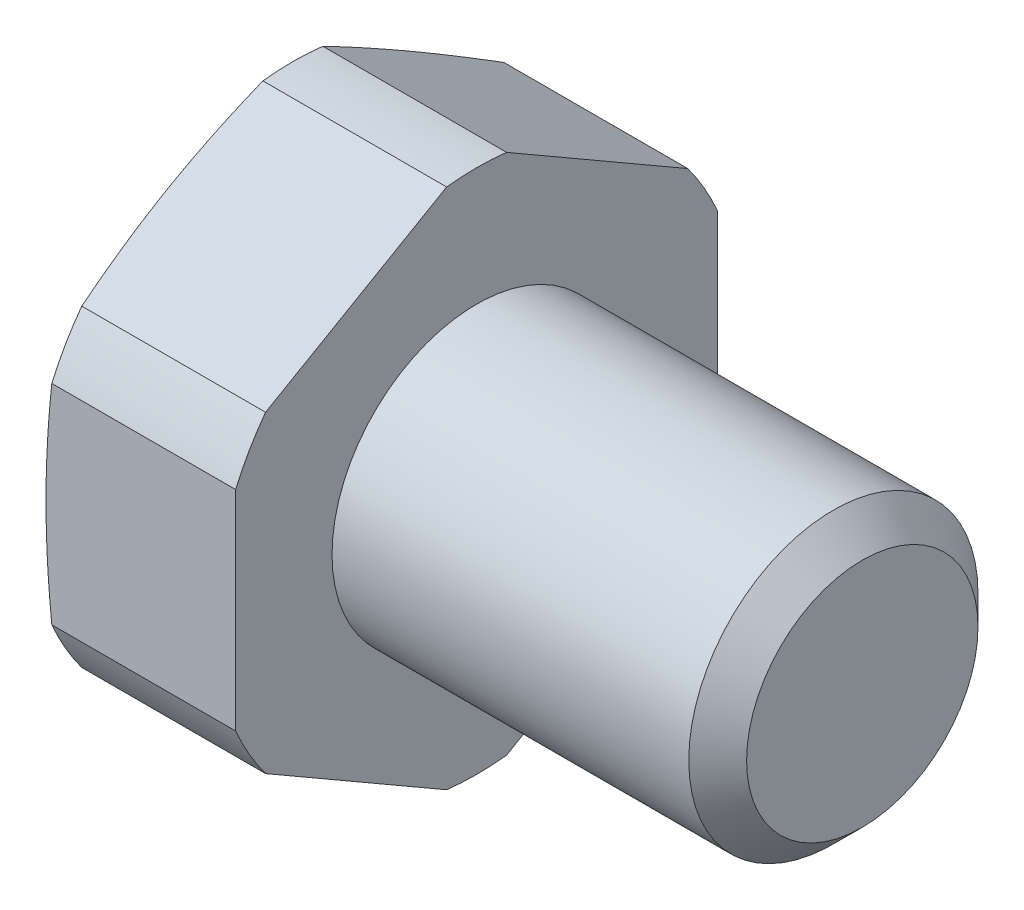
ISO-10303-21;
HEADER;
FILE_DESCRIPTION(('STEP AP214'),'2;1');
FILE_NAME('part.step','',(''),(''),'','','');
FILE_SCHEMA(('AUTOMOTIVE_DESIGN { 1 0 10303 214 1 1 1 1 }'));
ENDSEC;
DATA;
#1=APPLICATION_CONTEXT('core data for automotive mechanical design processes');
#2=APPLICATION_PROTOCOL_DEFINITION('international standard','automotive_design',2000,#1);
#3=PRODUCT_CONTEXT('',#1,'mechanical');
#4=PRODUCT('Part','Part','',(#3));
#5=PRODUCT_RELATED_PRODUCT_CATEGORY('part','',(#4));
#6=PRODUCT_DEFINITION_FORMATION('','',#4);
#7=PRODUCT_DEFINITION_CONTEXT('part definition',#1,'design');
#8=PRODUCT_DEFINITION('design','',#6,#7);
#9=PRODUCT_DEFINITION_SHAPE('','',#8);
#10=(LENGTH_UNIT() NAMED_UNIT(*) SI_UNIT(.MILLI.,.METRE.));
#11=(NAMED_UNIT(*) PLANE_ANGLE_UNIT() SI_UNIT($,.RADIAN.));
#12=(NAMED_UNIT(*) SI_UNIT($,.STERADIAN.) SOLID_ANGLE_UNIT());
#13=UNCERTAINTY_MEASURE_WITH_UNIT(LENGTH_MEASURE(1.E-05),#10,'distance_accuracy_value','');
#14=(GEOMETRIC_REPRESENTATION_CONTEXT(3) GLOBAL_UNCERTAINTY_ASSIGNED_CONTEXT((#13)) GLOBAL_UNIT_ASSIGNED_CONTEXT((#10,
#11,#12)) REPRESENTATION_CONTEXT('',''));
#15=CARTESIAN_POINT('',(0.,0.,0.));
#16=DIRECTION('',(0.,0.,1.));
#17=DIRECTION('',(1.,0.,0.));
#18=AXIS2_PLACEMENT_3D('',#15,#16,#17);
#19=CARTESIAN_POINT('',(-3.8124355652982,0.,0.));
#20=DIRECTION('',(1.,0.,0.));
#21=DIRECTION('',(0.,0.,-1.));
#22=AXIS2_PLACEMENT_3D('',#19,#20,#21);
#23=CONICAL_SURFACE('',#22,5.45,1.30899693899572);
#24=CARTESIAN_POINT('',(-4.,0.,0.));
#25=DIRECTION('',(-1.,0.,0.));
#26=DIRECTION('',(0.,0.,1.));
#27=AXIS2_PLACEMENT_3D('',#24,#25,#26);
#28=CIRCLE('',#27,4.75);
#29=CARTESIAN_POINT('',(-4.,0.,4.75));
#30=VERTEX_POINT('',#29);
#31=EDGE_CURVE('E136',#30,#30,#28,.T.);
#32=ORIENTED_EDGE('',*,*,#31,.F.);
#33=EDGE_LOOP('',(#32));
#34=FACE_BOUND('',#33,.T.);
#35=CARTESIAN_POINT('',(-3.8122355652982,3.24492698806514,-4.37962158981973));
#36=CARTESIAN_POINT('',(-3.8315035909995,3.33515905805743,-4.22333506012097));
#37=CARTESIAN_POINT('',(-3.84874992340172,3.42550504054801,-4.06685122818755));
#38=CARTESIAN_POINT('',(-3.87876035394968,3.60639535151776,-3.75354001899102));
#39=CARTESIAN_POINT('',(-3.89152379526239,3.69693970710852,-3.59671259476924));
#40=CARTESIAN_POINT('',(-3.91209179943862,3.87789023602862,-3.28329708502316));
#41=CARTESIAN_POINT('',(-3.91991159522667,3.96829596905989,-3.1267097621175));
#42=CARTESIAN_POINT('',(-3.93037186796461,4.14917681117598,-2.81341495345658));
#43=CARTESIAN_POINT('',(-3.93301270189222,4.2396519150491,-2.65670747672828));
#44=CARTESIAN_POINT('',(-3.93301270189222,4.42060212279532,-2.34329252327168));
#45=CARTESIAN_POINT('',(-3.93037186796461,4.51107722666843,-2.18658504654338));
#46=CARTESIAN_POINT('',(-3.91991159522667,4.69195806878452,-1.87329023788246));
#47=CARTESIAN_POINT('',(-3.91209179943862,4.78236380181579,-1.71670291497679));
#48=CARTESIAN_POINT('',(-3.89152379526239,4.96331433073589,-1.40328740523072));
#49=CARTESIAN_POINT('',(-3.87876035394968,5.05385868632665,-1.24645998100894));
#50=CARTESIAN_POINT('',(-3.84874992340171,5.2347489972964,-0.933148771812402));
#51=CARTESIAN_POINT('',(-3.83150359099949,5.32509497978698,-0.776664939878988));
#52=CARTESIAN_POINT('',(-3.81223556529819,5.41532704977928,-0.620378410180221));
#53=B_SPLINE_CURVE_WITH_KNOTS('',3,(#35,#36,#37,#38,#39,#40,#41,#42,#43,#44,#45,#46,#47,#48,#49,
#50,#51,#52),.UNSPECIFIED.,.F.,.F.,(4,2,2,2,2,2,2,2,4),(0.,0.54447599676277,1.08903173688009,
1.63190124482929,2.17473333231912,2.71756541980895,3.26043492775814,3.80499066787546,
4.34946666463823),.UNSPECIFIED.);
#54=CARTESIAN_POINT('',(-3.8124355652982,3.24586459681212,-4.37799760383234));
#55=VERTEX_POINT('',#54);
#56=CARTESIAN_POINT('',(-3.8124355652982,5.41438944103227,-0.622002396167662));
#57=VERTEX_POINT('',#56);
#58=EDGE_CURVE('E208',#55,#57,#53,.T.);
#59=ORIENTED_EDGE('',*,*,#58,.F.);
#60=CARTESIAN_POINT('',(-3.8124355652982,0.,0.));
#61=DIRECTION('',(-1.,0.,0.));
#62=DIRECTION('',(0.,0.,1.));
#63=AXIS2_PLACEMENT_3D('',#60,#61,#62);
#64=CIRCLE('',#63,5.45);
#65=CARTESIAN_POINT('',(-3.8124355652982,2.16852484422015,-5.));
#66=VERTEX_POINT('',#65);
#67=EDGE_CURVE('E291',#55,#66,#64,.T.);
#68=ORIENTED_EDGE('',*,*,#67,.T.);
#69=CARTESIAN_POINT('',(-2.830435154416,-7.62108614568719,-5.));
#70=CARTESIAN_POINT('',(-2.88120209797258,-7.3944237121134,-5.));
#71=CARTESIAN_POINT('',(-2.93134556516227,-7.16761907889242,-5.));
#72=CARTESIAN_POINT('',(-3.03004902948035,-6.71365560990672,-5.));
#73=CARTESIAN_POINT('',(-3.07860895773894,-6.4864967591857,-5.));
#74=CARTESIAN_POINT('',(-3.17385150931226,-6.03154950254371,-5.));
#75=CARTESIAN_POINT('',(-3.22053222527809,-5.80376069589011,-5.));
#76=CARTESIAN_POINT('',(-3.31151001956537,-5.34770783172051,-5.));
#77=CARTESIAN_POINT('',(-3.3558071181691,-5.11944377826557,-5.));
#78=CARTESIAN_POINT('',(-3.4411075281363,-4.66418646959809,-5.));
#79=CARTESIAN_POINT('',(-3.48213433474762,-4.43719763845752,-5.));
#80=CARTESIAN_POINT('',(-3.5605891401129,-3.98259997066756,-5.));
#81=CARTESIAN_POINT('',(-3.59801721846509,-3.75499114784598,-5.));
#82=CARTESIAN_POINT('',(-3.66842860196544,-3.29911107812409,-5.));
#83=CARTESIAN_POINT('',(-3.70141247969032,-3.07083992043547,-5.));
#84=CARTESIAN_POINT('',(-3.76196068204273,-2.61357172621781,-5.));
#85=CARTESIAN_POINT('',(-3.78952500224215,-2.38457468909583,-5.));
#86=CARTESIAN_POINT('',(-3.83845030974012,-1.92327707694904,-5.));
#87=CARTESIAN_POINT('',(-3.85973725345162,-1.69096853031646,-5.));
#88=CARTESIAN_POINT('',(-3.89463720444701,-1.22577076482486,-5.));
#89=CARTESIAN_POINT('',(-3.90825038771012,-0.992881559404892,-5.));
#90=CARTESIAN_POINT('',(-3.92700868255058,-0.526860013398159,-5.));
#91=CARTESIAN_POINT('',(-3.93215759017723,-0.293727828749551,-5.));
#92=CARTESIAN_POINT('',(-3.93367114199559,0.172565509188203,-5.));
#93=CARTESIAN_POINT('',(-3.93003579094568,0.405726662461588,-5.));
#94=CARTESIAN_POINT('',(-3.91418522340838,0.872602182612571,-5.));
#95=CARTESIAN_POINT('',(-3.9019387776737,1.10631546764104,-5.));
#96=CARTESIAN_POINT('',(-3.8695634215591,1.57319035782344,-5.));
#97=CARTESIAN_POINT('',(-3.84943433779392,1.80635195072894,-5.));
#98=CARTESIAN_POINT('',(-3.80230675741258,2.27212210256566,-5.));
#99=CARTESIAN_POINT('',(-3.77530380767398,2.50473020395075,-5.));
#100=CARTESIAN_POINT('',(-3.71554697344907,2.96919829473803,-5.));
#101=CARTESIAN_POINT('',(-3.68279307135858,3.20105828184795,-5.));
#102=CARTESIAN_POINT('',(-3.61492582370549,3.64858107787179,-5.));
#103=CARTESIAN_POINT('',(-3.58011659874086,3.86429046615706,-5.));
#104=CARTESIAN_POINT('',(-3.50712924185992,4.29514088007846,-5.));
#105=CARTESIAN_POINT('',(-3.46895101875147,4.51028189016725,-5.));
#106=CARTESIAN_POINT('',(-3.35031434414398,5.15498464345157,-5.));
#107=CARTESIAN_POINT('',(-3.26575944676272,5.58379089346185,-5.));
#108=CARTESIAN_POINT('',(-3.08936194162874,6.43998322963981,-5.));
#109=CARTESIAN_POINT('',(-2.99751759102386,6.86736895056686,-5.));
#110=CARTESIAN_POINT('',(-2.80885188867208,7.72100969351695,-5.));
#111=CARTESIAN_POINT('',(-2.71203082575452,8.14726477965122,-5.));
#112=CARTESIAN_POINT('',(-2.51586740601024,8.9947544783887,-5.));
#113=CARTESIAN_POINT('',(-2.41655941078842,9.41599708456601,-5.));
#114=CARTESIAN_POINT('',(-2.21545799548836,10.2578953303561,-5.));
#115=CARTESIAN_POINT('',(-2.11366453046326,10.6785509592085,-5.));
#116=CARTESIAN_POINT('',(-1.90836724186912,11.5188975285423,-5.));
#117=CARTESIAN_POINT('',(-1.80486566651573,11.9385890195114,-5.));
#118=CARTESIAN_POINT('',(-1.59644919766966,12.7776065494314,-5.));
#119=CARTESIAN_POINT('',(-1.49153435068999,13.1969325999283,-5.));
#120=CARTESIAN_POINT('',(-1.38611863930613,13.6161312291119,-5.));
#121=B_SPLINE_CURVE_WITH_KNOTS('',3,(#69,#70,#71,#72,#73,#74,#75,#76,#77,#78,#79,#80,#81,#82,
#83,#84,#85,#86,#87,#88,#89,#90,#91,#92,#93,#94,#95,#96,#97,#98,#99,#100,#101,#102,#103,#104,
#105,#106,#107,#108,#109,#110,#111,#112,#113,#114,#115,#116,#117,#118,#119,#120),.UNSPECIFIED.,
.F.,.F.,(4,2,2,2,2,2,2,2,2,2,2,2,2,2,2,2,2,2,2,2,2,2,2,2,2,4),(0.,0.696837321487225,
1.39370490886476,2.09126282716078,2.78881480897114,3.48079178070997,4.17275344348079,
4.86462587068375,5.5564988631845,6.25623321055747,6.95595151055346,7.65535591593532,
8.3547599424542,9.05671361858794,9.75868273565141,10.4611077745029,11.1635349635777,
11.8190031071993,12.4744889984981,13.785567701482,15.0969608231136,16.4082779222481,
17.7066391814984,19.0050239375285,20.3018179916293,21.5985694699626),.UNSPECIFIED.);
#122=CARTESIAN_POINT('',(-3.8124355652982,-2.16852484422015,-5.));
#123=VERTEX_POINT('',#122);
#124=EDGE_CURVE('E187',#123,#66,#121,.T.);
#125=ORIENTED_EDGE('',*,*,#124,.F.);
#126=CARTESIAN_POINT('',(-3.8124355652982,-3.24586459681213,-4.37799760383233));
#127=VERTEX_POINT('',#126);
#128=EDGE_CURVE('E186',#123,#127,#64,.T.);
#129=ORIENTED_EDGE('',*,*,#128,.T.);
#130=CARTESIAN_POINT('',(-3.81223556529819,-5.41532704977928,-0.620378410180224));
#131=CARTESIAN_POINT('',(-3.83150359099949,-5.32509497978698,-0.77666493987899));
#132=CARTESIAN_POINT('',(-3.84874992340171,-5.2347489972964,-0.933148771812404));
#133=CARTESIAN_POINT('',(-3.87876035394968,-5.05385868632665,-1.24645998100894));
#134=CARTESIAN_POINT('',(-3.89152379526239,-4.96331433073589,-1.40328740523072));
#135=CARTESIAN_POINT('',(-3.91209179943862,-4.78236380181579,-1.71670291497679));
#136=CARTESIAN_POINT('',(-3.91991159522667,-4.69195806878452,-1.87329023788246));
#137=CARTESIAN_POINT('',(-3.93037186796461,-4.51107722666843,-2.18658504654338));
#138=CARTESIAN_POINT('',(-3.93301270189222,-4.42060212279532,-2.34329252327168));
#139=CARTESIAN_POINT('',(-3.93301270189222,-4.2396519150491,-2.65670747672828));
#140=CARTESIAN_POINT('',(-3.93037186796461,-4.14917681117599,-2.81341495345658));
#141=CARTESIAN_POINT('',(-3.91991159522667,-3.96829596905989,-3.1267097621175));
#142=CARTESIAN_POINT('',(-3.91209179943862,-3.87789023602862,-3.28329708502316));
#143=CARTESIAN_POINT('',(-3.89152379526239,-3.69693970710853,-3.59671259476924));
#144=CARTESIAN_POINT('',(-3.87876035394968,-3.60639535151776,-3.75354001899102));
#145=CARTESIAN_POINT('',(-3.84874992340172,-3.42550504054802,-4.06685122818755));
#146=CARTESIAN_POINT('',(-3.8315035909995,-3.33515905805744,-4.22333506012097));
#147=CARTESIAN_POINT('',(-3.8122355652982,-3.24492698806514,-4.37962158981973));
#148=B_SPLINE_CURVE_WITH_KNOTS('',3,(#130,#131,#132,#133,#134,#135,#136,#137,#138,#139,#140,
#141,#142,#143,#144,#145,#146,#147),.UNSPECIFIED.,.F.,.F.,(4,2,2,2,2,2,2,2,4),(0.,
0.544475996762769,1.08903173688009,1.63190124482929,2.17473333231911,2.71756541980894,
3.26043492775814,3.80499066787546,4.34946666463823),.UNSPECIFIED.);
#149=CARTESIAN_POINT('',(-3.8124355652982,-5.41438944103226,-0.622002396167667));
#150=VERTEX_POINT('',#149);
#151=EDGE_CURVE('E273',#150,#127,#148,.T.);
#152=ORIENTED_EDGE('',*,*,#151,.F.);
#153=CARTESIAN_POINT('',(-3.8124355652982,-5.41438944103226,0.62200239616767));
#154=VERTEX_POINT('',#153);
#155=EDGE_CURVE('E293',#150,#154,#64,.T.);
#156=ORIENTED_EDGE('',*,*,#155,.T.);
#157=CARTESIAN_POINT('',(-3.8122355652982,-3.24492698806514,4.37962158981973));
#158=CARTESIAN_POINT('',(-3.8315035909995,-3.33515905805744,4.22333506012097));
#159=CARTESIAN_POINT('',(-3.84874992340172,-3.42550504054802,4.06685122818755));
#160=CARTESIAN_POINT('',(-3.87876035394968,-3.60639535151777,3.75354001899102));
#161=CARTESIAN_POINT('',(-3.89152379526239,-3.69693970710853,3.59671259476924));
#162=CARTESIAN_POINT('',(-3.91209179943862,-3.87789023602863,3.28329708502316));
#163=CARTESIAN_POINT('',(-3.91991159522667,-3.96829596905989,3.1267097621175));
#164=CARTESIAN_POINT('',(-3.93037186796461,-4.14917681117599,2.81341495345658));
#165=CARTESIAN_POINT('',(-3.93301270189222,-4.2396519150491,2.65670747672828));
#166=CARTESIAN_POINT('',(-3.93301270189222,-4.42060212279532,2.34329252327168));
#167=CARTESIAN_POINT('',(-3.93037186796461,-4.51107722666843,2.18658504654338));
#168=CARTESIAN_POINT('',(-3.91991159522667,-4.69195806878452,1.87329023788246));
#169=CARTESIAN_POINT('',(-3.91209179943862,-4.78236380181579,1.7167029149768));
#170=CARTESIAN_POINT('',(-3.89152379526239,-4.96331433073589,1.40328740523072));
#171=CARTESIAN_POINT('',(-3.87876035394968,-5.05385868632665,1.24645998100894));
#172=CARTESIAN_POINT('',(-3.84874992340171,-5.2347489972964,0.933148771812408));
#173=CARTESIAN_POINT('',(-3.83150359099949,-5.32509497978698,0.776664939878994));
#174=CARTESIAN_POINT('',(-3.81223556529819,-5.41532704977927,0.620378410180227));
#175=B_SPLINE_CURVE_WITH_KNOTS('',3,(#157,#158,#159,#160,#161,#162,#163,#164,#165,#166,#167,
#168,#169,#170,#171,#172,#173,#174),.UNSPECIFIED.,.F.,.F.,(4,2,2,2,2,2,2,2,4),(0.,
0.544475996762769,1.08903173688009,1.63190124482928,2.17473333231911,2.71756541980894,
3.26043492775813,3.80499066787545,4.34946666463822),.UNSPECIFIED.);
#176=CARTESIAN_POINT('',(-3.8124355652982,-3.24586459681213,4.37799760383233));
#177=VERTEX_POINT('',#176);
#178=EDGE_CURVE('E262',#177,#154,#175,.T.);
#179=ORIENTED_EDGE('',*,*,#178,.F.);
#180=CARTESIAN_POINT('',(-3.8124355652982,-2.16852484422015,5.));
#181=VERTEX_POINT('',#180);
#182=EDGE_CURVE('E154',#177,#181,#64,.T.);
#183=ORIENTED_EDGE('',*,*,#182,.T.);
#184=CARTESIAN_POINT('',(-2.830435154416,-7.62108614568719,5.));
#185=CARTESIAN_POINT('',(-2.88120209797258,-7.3944237121134,5.));
#186=CARTESIAN_POINT('',(-2.93134556516227,-7.16761907889242,5.));
#187=CARTESIAN_POINT('',(-3.03004902948034,-6.71365560990672,5.));
#188=CARTESIAN_POINT('',(-3.07860895773893,-6.4864967591857,5.));
#189=CARTESIAN_POINT('',(-3.17385150931226,-6.03154950254371,5.));
#190=CARTESIAN_POINT('',(-3.22053222527809,-5.80376069589011,5.));
#191=CARTESIAN_POINT('',(-3.31151001956537,-5.34770783172051,5.));
#192=CARTESIAN_POINT('',(-3.3558071181691,-5.11944377826557,5.));
#193=CARTESIAN_POINT('',(-3.4411075281363,-4.66418646959809,5.));
#194=CARTESIAN_POINT('',(-3.48213433474762,-4.43719763845752,5.));
#195=CARTESIAN_POINT('',(-3.5605891401129,-3.98259997066757,5.));
#196=CARTESIAN_POINT('',(-3.59801721846509,-3.75499114784599,5.));
#197=CARTESIAN_POINT('',(-3.66842860196544,-3.29911107812409,5.));
#198=CARTESIAN_POINT('',(-3.70141247969032,-3.07083992043547,5.));
#199=CARTESIAN_POINT('',(-3.76196068204273,-2.61357172621781,5.));
#200=CARTESIAN_POINT('',(-3.78952500224215,-2.38457468909583,5.));
#201=CARTESIAN_POINT('',(-3.83845030974012,-1.92327707694904,5.));
#202=CARTESIAN_POINT('',(-3.85973725345162,-1.69096853031646,5.));
#203=CARTESIAN_POINT('',(-3.89463720444701,-1.22577076482486,5.));
#204=CARTESIAN_POINT('',(-3.90825038771012,-0.992881559404891,5.));
#205=CARTESIAN_POINT('',(-3.92700868255058,-0.526860013398159,5.));
#206=CARTESIAN_POINT('',(-3.93215759017723,-0.293727828749551,5.));
#207=CARTESIAN_POINT('',(-3.93367114199559,0.172565509188203,5.));
#208=CARTESIAN_POINT('',(-3.93003579094568,0.405726662461588,5.));
#209=CARTESIAN_POINT('',(-3.91418522340838,0.872602182612571,5.));
#210=CARTESIAN_POINT('',(-3.9019387776737,1.10631546764104,5.));
#211=CARTESIAN_POINT('',(-3.8695634215591,1.57319035782344,5.));
#212=CARTESIAN_POINT('',(-3.84943433779392,1.80635195072894,5.));
#213=CARTESIAN_POINT('',(-3.80230675741258,2.27212210256566,5.));
#214=CARTESIAN_POINT('',(-3.77530380767398,2.50473020395075,5.));
#215=CARTESIAN_POINT('',(-3.71554697344907,2.96919829473803,5.));
#216=CARTESIAN_POINT('',(-3.68279307135858,3.20105828184795,5.));
#217=CARTESIAN_POINT('',(-3.6149258237055,3.64858107787179,5.));
#218=CARTESIAN_POINT('',(-3.58011659874086,3.86429046615706,5.));
#219=CARTESIAN_POINT('',(-3.50712924185992,4.29514088007846,5.));
#220=CARTESIAN_POINT('',(-3.46895101875147,4.51028189016725,5.));
#221=CARTESIAN_POINT('',(-3.35031434414398,5.15498464345157,5.));
#222=CARTESIAN_POINT('',(-3.26575944676272,5.58379089346186,4.99999999999999));
#223=CARTESIAN_POINT('',(-3.08936194162874,6.43998322963982,4.99999999999999));
#224=CARTESIAN_POINT('',(-2.99751759102386,6.86736895056687,4.99999999999999));
#225=CARTESIAN_POINT('',(-2.80885188867208,7.72100969351695,4.99999999999999));
#226=CARTESIAN_POINT('',(-2.71203082575452,8.14726477965122,4.99999999999999));
#227=CARTESIAN_POINT('',(-2.51586740601024,8.9947544783887,4.99999999999999));
#228=CARTESIAN_POINT('',(-2.41655941078842,9.41599708456601,4.99999999999999));
#229=CARTESIAN_POINT('',(-2.21545799548836,10.2578953303561,4.99999999999999));
#230=CARTESIAN_POINT('',(-2.11366453046326,10.6785509592085,4.99999999999999));
#231=CARTESIAN_POINT('',(-1.90836724186912,11.5188975285423,4.99999999999999));
#232=CARTESIAN_POINT('',(-1.80486566651573,11.9385890195114,4.99999999999999));
#233=CARTESIAN_POINT('',(-1.59644919766966,12.7776065494314,4.99999999999999));
#234=CARTESIAN_POINT('',(-1.49153435068999,13.1969325999283,4.99999999999999));
#235=CARTESIAN_POINT('',(-1.38611863930613,13.6161312291119,4.99999999999999));
#236=B_SPLINE_CURVE_WITH_KNOTS('',3,(#184,#185,#186,#187,#188,#189,#190,#191,#192,#193,#194,
#195,#196,#197,#198,#199,#200,#201,#202,#203,#204,#205,#206,#207,#208,#209,#210,#211,#212,#213,
#214,#215,#216,#217,#218,#219,#220,#221,#222,#223,#224,#225,#226,#227,#228,#229,#230,#231,#232,
#233,#234,#235),.UNSPECIFIED.,.F.,.F.,(4,2,2,2,2,2,2,2,2,2,2,2,2,2,2,2,2,2,2,2,2,2,2,2,2,4),(0.,
0.696837321487225,1.39370490886476,2.09126282716078,2.78881480897114,3.48079178070997,
4.17275344348079,4.86462587068375,5.5564988631845,6.25623321055747,6.95595151055346,
7.65535591593532,8.3547599424542,9.05671361858794,9.75868273565141,10.4611077745029,
11.1635349635777,11.8190031071993,12.4744889984981,13.785567701482,15.0969608231136,
16.4082779222481,17.7066391814984,19.0050239375285,20.3018179916293,21.5985694699626),.UNSPECIFIED.);
#237=CARTESIAN_POINT('',(-3.8124355652982,2.16852484422015,5.));
#238=VERTEX_POINT('',#237);
#239=EDGE_CURVE('E245',#238,#181,#236,.F.);
#240=ORIENTED_EDGE('',*,*,#239,.F.);
#241=CARTESIAN_POINT('',(-3.8124355652982,3.24586459681212,4.37799760383233));
#242=VERTEX_POINT('',#241);
#243=EDGE_CURVE('E162',#238,#242,#64,.T.);
#244=ORIENTED_EDGE('',*,*,#243,.T.);
#245=CARTESIAN_POINT('',(-3.81223556529819,5.41532704977928,0.620378410180221));
#246=CARTESIAN_POINT('',(-3.83150359099949,5.32509497978698,0.776664939878988));
#247=CARTESIAN_POINT('',(-3.84874992340172,5.2347489972964,0.933148771812402));
#248=CARTESIAN_POINT('',(-3.87876035394968,5.05385868632665,1.24645998100894));
#249=CARTESIAN_POINT('',(-3.89152379526239,4.96331433073589,1.40328740523072));
#250=CARTESIAN_POINT('',(-3.91209179943862,4.78236380181579,1.71670291497679));
#251=CARTESIAN_POINT('',(-3.91991159522667,4.69195806878452,1.87329023788246));
#252=CARTESIAN_POINT('',(-3.93037186796461,4.51107722666843,2.18658504654338));
#253=CARTESIAN_POINT('',(-3.93301270189222,4.42060212279532,2.34329252327168));
#254=CARTESIAN_POINT('',(-3.93301270189222,4.2396519150491,2.65670747672828));
#255=CARTESIAN_POINT('',(-3.93037186796461,4.14917681117598,2.81341495345658));
#256=CARTESIAN_POINT('',(-3.91991159522667,3.96829596905989,3.1267097621175));
#257=CARTESIAN_POINT('',(-3.91209179943862,3.87789023602862,3.28329708502316));
#258=CARTESIAN_POINT('',(-3.89152379526239,3.69693970710852,3.59671259476924));
#259=CARTESIAN_POINT('',(-3.87876035394968,3.60639535151776,3.75354001899102));
#260=CARTESIAN_POINT('',(-3.84874992340172,3.42550504054801,4.06685122818755));
#261=CARTESIAN_POINT('',(-3.8315035909995,3.33515905805743,4.22333506012097));
#262=CARTESIAN_POINT('',(-3.8122355652982,3.24492698806514,4.37962158981973));
#263=B_SPLINE_CURVE_WITH_KNOTS('',3,(#245,#246,#247,#248,#249,#250,#251,#252,#253,#254,#255,
#256,#257,#258,#259,#260,#261,#262),.UNSPECIFIED.,.F.,.F.,(4,2,2,2,2,2,2,2,4),(0.,
0.54447599676277,1.08903173688009,1.63190124482929,2.17473333231912,2.71756541980895,
3.26043492775814,3.80499066787546,4.34946666463823),.UNSPECIFIED.);
#264=CARTESIAN_POINT('',(-3.8124355652982,5.41438944103226,0.622002396167666));
#265=VERTEX_POINT('',#264);
#266=EDGE_CURVE('E146',#265,#242,#263,.T.);
#267=ORIENTED_EDGE('',*,*,#266,.F.);
#268=EDGE_CURVE('E145',#265,#57,#64,.T.);
#269=ORIENTED_EDGE('',*,*,#268,.T.);
#270=EDGE_LOOP('',(#59,#68,#125,#129,#152,#156,#179,#183,#240,#244,#267,#269));
#271=FACE_BOUND('',#270,.T.);
#272=ADVANCED_FACE('F37',(#34,#271),#23,.T.);
#273=CARTESIAN_POINT('',(-1000.,0.,0.));
#274=DIRECTION('',(-1.,0.,0.));
#275=DIRECTION('',(0.,0.,1.));
#276=AXIS2_PLACEMENT_3D('',#273,#274,#275);
#277=CYLINDRICAL_SURFACE('',#276,5.45);
#278=DIRECTION('',(-1.,0.,0.));
#279=VECTOR('',#278,1.);
#280=CARTESIAN_POINT('',(-1000.,3.24586459681212,-4.37799760383234));
#281=LINE('',#280,#279);
#282=CARTESIAN_POINT('',(0.,3.24586459681213,-4.37799760383233));
#283=VERTEX_POINT('',#282);
#284=EDGE_CURVE('E217',#283,#55,#281,.T.);
#285=ORIENTED_EDGE('',*,*,#284,.F.);
#286=CARTESIAN_POINT('',(0.,0.,0.));
#287=DIRECTION('',(-1.,0.,0.));
#288=DIRECTION('',(0.,0.,1.));
#289=AXIS2_PLACEMENT_3D('',#286,#287,#288);
#290=CIRCLE('',#289,5.45);
#291=CARTESIAN_POINT('',(0.,2.16852484422015,-5.));
#292=VERTEX_POINT('',#291);
#293=EDGE_CURVE('E152',#283,#292,#290,.T.);
#294=ORIENTED_EDGE('',*,*,#293,.T.);
#295=DIRECTION('',(-1.,0.,0.));
#296=VECTOR('',#295,1.);
#297=CARTESIAN_POINT('',(-1000.,2.16852484422015,-5.));
#298=LINE('',#297,#296);
#299=EDGE_CURVE('E178',#66,#292,#298,.F.);
#300=ORIENTED_EDGE('',*,*,#299,.F.);
#301=ORIENTED_EDGE('',*,*,#67,.F.);
#302=EDGE_LOOP('',(#285,#294,#300,#301));
#303=FACE_BOUND('',#302,.T.);
#304=ADVANCED_FACE('F292',(#303),#277,.T.);
#305=DIRECTION('',(-1.,0.,0.));
#306=VECTOR('',#305,1.);
#307=CARTESIAN_POINT('',(-1000.,5.41438944103227,-0.622002396167662));
#308=LINE('',#307,#306);
#309=CARTESIAN_POINT('',(0.,5.41438944103227,-0.622002396167667));
#310=VERTEX_POINT('',#309);
#311=EDGE_CURVE('E284',#57,#310,#308,.F.);
#312=ORIENTED_EDGE('',*,*,#311,.F.);
#313=ORIENTED_EDGE('',*,*,#268,.F.);
#314=DIRECTION('',(-1.,0.,0.));
#315=VECTOR('',#314,1.);
#316=CARTESIAN_POINT('',(-1000.,5.41438944103226,0.622002396167666));
#317=LINE('',#316,#315);
#318=CARTESIAN_POINT('',(0.,5.41438944103227,0.622002396167667));
#319=VERTEX_POINT('',#318);
#320=EDGE_CURVE('E127',#319,#265,#317,.T.);
#321=ORIENTED_EDGE('',*,*,#320,.F.);
#322=EDGE_CURVE('E143',#319,#310,#290,.T.);
#323=ORIENTED_EDGE('',*,*,#322,.T.);
#324=EDGE_LOOP('',(#312,#313,#321,#323));
#325=FACE_BOUND('',#324,.T.);
#326=ADVANCED_FACE('F142',(#325),#277,.T.);
#327=DIRECTION('',(-1.,0.,0.));
#328=VECTOR('',#327,1.);
#329=CARTESIAN_POINT('',(-1000.,-2.16852484422015,-5.));
#330=LINE('',#329,#328);
#331=CARTESIAN_POINT('',(0.,-2.16852484422015,-5.));
#332=VERTEX_POINT('',#331);
#333=EDGE_CURVE('E175',#332,#123,#330,.T.);
#334=ORIENTED_EDGE('',*,*,#333,.F.);
#335=CARTESIAN_POINT('',(0.,-3.24586459681213,-4.37799760383233));
#336=VERTEX_POINT('',#335);
#337=EDGE_CURVE('E157',#332,#336,#290,.T.);
#338=ORIENTED_EDGE('',*,*,#337,.T.);
#339=DIRECTION('',(-1.,0.,0.));
#340=VECTOR('',#339,1.);
#341=CARTESIAN_POINT('',(-1000.,-3.24586459681213,-4.37799760383233));
#342=LINE('',#341,#340);
#343=EDGE_CURVE('E268',#127,#336,#342,.F.);
#344=ORIENTED_EDGE('',*,*,#343,.F.);
#345=ORIENTED_EDGE('',*,*,#128,.F.);
#346=EDGE_LOOP('',(#334,#338,#344,#345));
#347=FACE_BOUND('',#346,.T.);
#348=ADVANCED_FACE('F183',(#347),#277,.T.);
#349=DIRECTION('',(-1.,0.,0.));
#350=VECTOR('',#349,1.);
#351=CARTESIAN_POINT('',(-1000.,-5.41438944103226,-0.622002396167667));
#352=LINE('',#351,#350);
#353=CARTESIAN_POINT('',(0.,-5.41438944103226,-0.622002396167669));
#354=VERTEX_POINT('',#353);
#355=EDGE_CURVE('E271',#354,#150,#352,.T.);
#356=ORIENTED_EDGE('',*,*,#355,.F.);
#357=CARTESIAN_POINT('',(0.,-5.41438944103226,0.62200239616767));
#358=VERTEX_POINT('',#357);
#359=EDGE_CURVE('E191',#354,#358,#290,.T.);
#360=ORIENTED_EDGE('',*,*,#359,.T.);
#361=DIRECTION('',(-1.,0.,0.));
#362=VECTOR('',#361,1.);
#363=CARTESIAN_POINT('',(-1000.,-5.41438944103226,0.62200239616767));
#364=LINE('',#363,#362);
#365=EDGE_CURVE('E60',#154,#358,#364,.F.);
#366=ORIENTED_EDGE('',*,*,#365,.F.);
#367=ORIENTED_EDGE('',*,*,#155,.F.);
#368=EDGE_LOOP('',(#356,#360,#366,#367));
#369=FACE_BOUND('',#368,.T.);
#370=ADVANCED_FACE('F312',(#369),#277,.T.);
#371=DIRECTION('',(-1.,0.,0.));
#372=VECTOR('',#371,1.);
#373=CARTESIAN_POINT('',(-1000.,-3.24586459681213,4.37799760383233));
#374=LINE('',#373,#372);
#375=CARTESIAN_POINT('',(0.,-3.24586459681213,4.37799760383233));
#376=VERTEX_POINT('',#375);
#377=EDGE_CURVE('E269',#376,#177,#374,.T.);
#378=ORIENTED_EDGE('',*,*,#377,.F.);
#379=CARTESIAN_POINT('',(0.,-2.16852484422015,5.));
#380=VERTEX_POINT('',#379);
#381=EDGE_CURVE('E155',#376,#380,#290,.T.);
#382=ORIENTED_EDGE('',*,*,#381,.T.);
#383=DIRECTION('',(-1.,0.,0.));
#384=VECTOR('',#383,1.);
#385=CARTESIAN_POINT('',(-1000.,-2.16852484422015,5.));
#386=LINE('',#385,#384);
#387=EDGE_CURVE('E52',#181,#380,#386,.F.);
#388=ORIENTED_EDGE('',*,*,#387,.F.);
#389=ORIENTED_EDGE('',*,*,#182,.F.);
#390=EDGE_LOOP('',(#378,#382,#388,#389));
#391=FACE_BOUND('',#390,.T.);
#392=ADVANCED_FACE('F302',(#391),#277,.T.);
#393=DIRECTION('',(-1.,0.,0.));
#394=VECTOR('',#393,1.);
#395=CARTESIAN_POINT('',(-1000.,2.16852484422015,5.));
#396=LINE('',#395,#394);
#397=CARTESIAN_POINT('',(0.,2.16852484422015,5.));
#398=VERTEX_POINT('',#397);
#399=EDGE_CURVE('E243',#398,#238,#396,.T.);
#400=ORIENTED_EDGE('',*,*,#399,.F.);
#401=CARTESIAN_POINT('',(0.,3.24586459681213,4.37799760383233));
#402=VERTEX_POINT('',#401);
#403=EDGE_CURVE('E151',#398,#402,#290,.T.);
#404=ORIENTED_EDGE('',*,*,#403,.T.);
#405=DIRECTION('',(-1.,0.,0.));
#406=VECTOR('',#405,1.);
#407=CARTESIAN_POINT('',(-1000.,3.24586459681212,4.37799760383233));
#408=LINE('',#407,#406);
#409=EDGE_CURVE('E130',#242,#402,#408,.F.);
#410=ORIENTED_EDGE('',*,*,#409,.F.);
#411=ORIENTED_EDGE('',*,*,#243,.F.);
#412=EDGE_LOOP('',(#400,#404,#410,#411));
#413=FACE_BOUND('',#412,.T.);
#414=ADVANCED_FACE('F305',(#413),#277,.T.);
#415=CARTESIAN_POINT('',(0.,5.45,0.));
#416=DIRECTION('',(-1.,0.,0.));
#417=DIRECTION('',(0.,0.,1.));
#418=AXIS2_PLACEMENT_3D('',#415,#416,#417);
#419=PLANE('',#418);
#420=CARTESIAN_POINT('',(0.,0.,0.));
#421=DIRECTION('',(-1.,0.,0.));
#422=DIRECTION('',(0.,0.,1.));
#423=AXIS2_PLACEMENT_3D('',#420,#421,#422);
#424=CIRCLE('',#423,3.);
#425=CARTESIAN_POINT('',(0.,0.,3.));
#426=VERTEX_POINT('',#425);
#427=EDGE_CURVE('E160',#426,#426,#424,.T.);
#428=ORIENTED_EDGE('',*,*,#427,.T.);
#429=EDGE_LOOP('',(#428));
#430=FACE_BOUND('',#429,.T.);
#431=DIRECTION('',(0.,-0.5,-0.866025403784439));
#432=VECTOR('',#431,1.);
#433=CARTESIAN_POINT('',(0.,5.69262701892219,-0.140080774687405));
#434=LINE('',#433,#432);
#435=EDGE_CURVE('E12',#310,#283,#434,.T.);
#436=ORIENTED_EDGE('',*,*,#435,.F.);
#437=ORIENTED_EDGE('',*,*,#322,.F.);
#438=DIRECTION('',(0.,0.5,-0.866025403784439));
#439=VECTOR('',#438,1.);
#440=CARTESIAN_POINT('',(0.,5.69262701892219,0.140080774687405));
#441=LINE('',#440,#439);
#442=EDGE_CURVE('E124',#402,#319,#441,.T.);
#443=ORIENTED_EDGE('',*,*,#442,.F.);
#444=ORIENTED_EDGE('',*,*,#403,.F.);
#445=DIRECTION('',(0.,1.,0.));
#446=VECTOR('',#445,1.);
#447=CARTESIAN_POINT('',(0.,5.45,5.));
#448=LINE('',#447,#446);
#449=EDGE_CURVE('E135',#380,#398,#448,.T.);
#450=ORIENTED_EDGE('',*,*,#449,.F.);
#451=ORIENTED_EDGE('',*,*,#381,.F.);
#452=DIRECTION('',(0.,0.5,0.866025403784439));
#453=VECTOR('',#452,1.);
#454=CARTESIAN_POINT('',(0.,-2.9676270189222,4.85991922531259));
#455=LINE('',#454,#453);
#456=EDGE_CURVE('E168',#358,#376,#455,.T.);
#457=ORIENTED_EDGE('',*,*,#456,.F.);
#458=ORIENTED_EDGE('',*,*,#359,.F.);
#459=DIRECTION('',(0.,-0.5,0.866025403784439));
#460=VECTOR('',#459,1.);
#461=CARTESIAN_POINT('',(0.,-2.9676270189222,-4.85991922531259));
#462=LINE('',#461,#460);
#463=EDGE_CURVE('E170',#336,#354,#462,.T.);
#464=ORIENTED_EDGE('',*,*,#463,.F.);
#465=ORIENTED_EDGE('',*,*,#337,.F.);
#466=DIRECTION('',(0.,-1.,0.));
#467=VECTOR('',#466,1.);
#468=CARTESIAN_POINT('',(0.,5.45,-5.));
#469=LINE('',#468,#467);
#470=EDGE_CURVE('E45',#292,#332,#469,.T.);
#471=ORIENTED_EDGE('',*,*,#470,.F.);
#472=ORIENTED_EDGE('',*,*,#293,.F.);
#473=EDGE_LOOP('',(#436,#437,#443,#444,#450,#451,#457,#458,#464,#465,#471,#472));
#474=FACE_BOUND('',#473,.T.);
#475=ADVANCED_FACE('F149',(#430,#474),#419,.F.);
#476=CARTESIAN_POINT('',(-4.,0.,0.));
#477=DIRECTION('',(1.,0.,0.));
#478=DIRECTION('',(0.,0.,-1.));
#479=AXIS2_PLACEMENT_3D('',#476,#477,#478);
#480=PLANE('',#479);
#481=ORIENTED_EDGE('',*,*,#31,.T.);
#482=EDGE_LOOP('',(#481));
#483=FACE_BOUND('',#482,.T.);
#484=ADVANCED_FACE('F39',(#483),#480,.F.);
#485=CARTESIAN_POINT('',(-1000.,0.,0.));
#486=DIRECTION('',(-1.,0.,0.));
#487=DIRECTION('',(0.,0.,1.));
#488=AXIS2_PLACEMENT_3D('',#485,#486,#487);
#489=CYLINDRICAL_SURFACE('',#488,3.);
#490=ORIENTED_EDGE('',*,*,#427,.F.);
#491=EDGE_LOOP('',(#490));
#492=FACE_BOUND('',#491,.T.);
#493=CARTESIAN_POINT('',(7.40000000000007,0.,0.));
#494=DIRECTION('',(-1.,0.,0.));
#495=DIRECTION('',(0.,0.,1.));
#496=AXIS2_PLACEMENT_3D('',#493,#494,#495);
#497=CIRCLE('',#496,3.);
#498=CARTESIAN_POINT('',(7.40000000000007,0.,3.));
#499=VERTEX_POINT('',#498);
#500=EDGE_CURVE('E200',#499,#499,#497,.T.);
#501=ORIENTED_EDGE('',*,*,#500,.T.);
#502=EDGE_LOOP('',(#501));
#503=FACE_BOUND('',#502,.T.);
#504=ADVANCED_FACE('F321',(#492,#503),#489,.T.);
#505=CARTESIAN_POINT('',(8.00000000000001,0.,0.));
#506=DIRECTION('',(-1.,0.,0.));
#507=DIRECTION('',(0.,0.,1.));
#508=AXIS2_PLACEMENT_3D('',#505,#506,#507);
#509=CONICAL_SURFACE('',#508,2.4,0.785398163397507);
#510=ORIENTED_EDGE('',*,*,#500,.F.);
#511=EDGE_LOOP('',(#510));
#512=FACE_BOUND('',#511,.T.);
#513=CARTESIAN_POINT('',(8.00000000000001,0.,0.));
#514=DIRECTION('',(-1.,0.,0.));
#515=DIRECTION('',(0.,0.,1.));
#516=AXIS2_PLACEMENT_3D('',#513,#514,#515);
#517=CIRCLE('',#516,2.4);
#518=CARTESIAN_POINT('',(8.00000000000001,0.,2.4));
#519=VERTEX_POINT('',#518);
#520=EDGE_CURVE('E204',#519,#519,#517,.T.);
#521=ORIENTED_EDGE('',*,*,#520,.T.);
#522=EDGE_LOOP('',(#521));
#523=FACE_BOUND('',#522,.T.);
#524=ADVANCED_FACE('F325',(#512,#523),#509,.T.);
#525=CARTESIAN_POINT('',(8.00000000000001,2.4,0.));
#526=DIRECTION('',(-1.,0.,0.));
#527=DIRECTION('',(0.,0.,1.));
#528=AXIS2_PLACEMENT_3D('',#525,#526,#527);
#529=PLANE('',#528);
#530=ORIENTED_EDGE('',*,*,#520,.F.);
#531=EDGE_LOOP('',(#530));
#532=FACE_BOUND('',#531,.T.);
#533=ADVANCED_FACE('F233',(#532),#529,.F.);
#534=CARTESIAN_POINT('',(24.037812018269,2.88675134594813,5.));
#535=DIRECTION('',(0.,0.866025403784439,0.5));
#536=DIRECTION('',(0.,-0.5,0.866025403784439));
#537=AXIS2_PLACEMENT_3D('',#534,#535,#536);
#538=PLANE('',#537);
#539=ORIENTED_EDGE('',*,*,#266,.T.);
#540=ORIENTED_EDGE('',*,*,#409,.T.);
#541=ORIENTED_EDGE('',*,*,#442,.T.);
#542=ORIENTED_EDGE('',*,*,#320,.T.);
#543=EDGE_LOOP('',(#539,#540,#541,#542));
#544=FACE_BOUND('',#543,.T.);
#545=ADVANCED_FACE('F126',(#544),#538,.T.);
#546=CARTESIAN_POINT('',(24.037812018269,-2.88675134594813,5.));
#547=DIRECTION('',(0.,0.,1.));
#548=DIRECTION('',(0.,-1.,0.));
#549=AXIS2_PLACEMENT_3D('',#546,#547,#548);
#550=PLANE('',#549);
#551=ORIENTED_EDGE('',*,*,#239,.T.);
#552=ORIENTED_EDGE('',*,*,#387,.T.);
#553=ORIENTED_EDGE('',*,*,#449,.T.);
#554=ORIENTED_EDGE('',*,*,#399,.T.);
#555=EDGE_LOOP('',(#551,#552,#553,#554));
#556=FACE_BOUND('',#555,.T.);
#557=ADVANCED_FACE('F232',(#556),#550,.T.);
#558=CARTESIAN_POINT('',(24.037812018269,-5.77350269189626,0.));
#559=DIRECTION('',(0.,-0.866025403784439,0.5));
#560=DIRECTION('',(0.,-0.5,-0.866025403784439));
#561=AXIS2_PLACEMENT_3D('',#558,#559,#560);
#562=PLANE('',#561);
#563=ORIENTED_EDGE('',*,*,#178,.T.);
#564=ORIENTED_EDGE('',*,*,#365,.T.);
#565=ORIENTED_EDGE('',*,*,#456,.T.);
#566=ORIENTED_EDGE('',*,*,#377,.T.);
#567=EDGE_LOOP('',(#563,#564,#565,#566));
#568=FACE_BOUND('',#567,.T.);
#569=ADVANCED_FACE('F256',(#568),#562,.T.);
#570=CARTESIAN_POINT('',(24.037812018269,-2.88675134594813,-5.));
#571=DIRECTION('',(0.,-0.866025403784439,-0.5));
#572=DIRECTION('',(0.,0.5,-0.866025403784439));
#573=AXIS2_PLACEMENT_3D('',#570,#571,#572);
#574=PLANE('',#573);
#575=ORIENTED_EDGE('',*,*,#151,.T.);
#576=ORIENTED_EDGE('',*,*,#343,.T.);
#577=ORIENTED_EDGE('',*,*,#463,.T.);
#578=ORIENTED_EDGE('',*,*,#355,.T.);
#579=EDGE_LOOP('',(#575,#576,#577,#578));
#580=FACE_BOUND('',#579,.T.);
#581=ADVANCED_FACE('F259',(#580),#574,.T.);
#582=CARTESIAN_POINT('',(24.037812018269,2.88675134594813,-5.));
#583=DIRECTION('',(0.,0.,-1.));
#584=DIRECTION('',(0.,1.,0.));
#585=AXIS2_PLACEMENT_3D('',#582,#583,#584);
#586=PLANE('',#585);
#587=ORIENTED_EDGE('',*,*,#124,.T.);
#588=ORIENTED_EDGE('',*,*,#299,.T.);
#589=ORIENTED_EDGE('',*,*,#470,.T.);
#590=ORIENTED_EDGE('',*,*,#333,.T.);
#591=EDGE_LOOP('',(#587,#588,#589,#590));
#592=FACE_BOUND('',#591,.T.);
#593=ADVANCED_FACE('F174',(#592),#586,.T.);
#594=CARTESIAN_POINT('',(24.037812018269,5.77350269189626,0.));
#595=DIRECTION('',(0.,0.866025403784439,-0.5));
#596=DIRECTION('',(0.,0.5,0.866025403784439));
#597=AXIS2_PLACEMENT_3D('',#594,#595,#596);
#598=PLANE('',#597);
#599=ORIENTED_EDGE('',*,*,#58,.T.);
#600=ORIENTED_EDGE('',*,*,#311,.T.);
#601=ORIENTED_EDGE('',*,*,#435,.T.);
#602=ORIENTED_EDGE('',*,*,#284,.T.);
#603=EDGE_LOOP('',(#599,#600,#601,#602));
#604=FACE_BOUND('',#603,.T.);
#605=ADVANCED_FACE('F221',(#604),#598,.T.);
#606=CLOSED_SHELL('',(#272,#304,#326,#348,#370,#392,#414,#475,#484,#504,#524,#533,#545,#557,
#569,#581,#593,#605));
#607=MANIFOLD_SOLID_BREP('B2',#606);
#608=ADVANCED_BREP_SHAPE_REPRESENTATION('',(#18,#607),#14);
#609=SHAPE_DEFINITION_REPRESENTATION(#9,#608);
ENDSEC;
END-ISO-10303-21;
